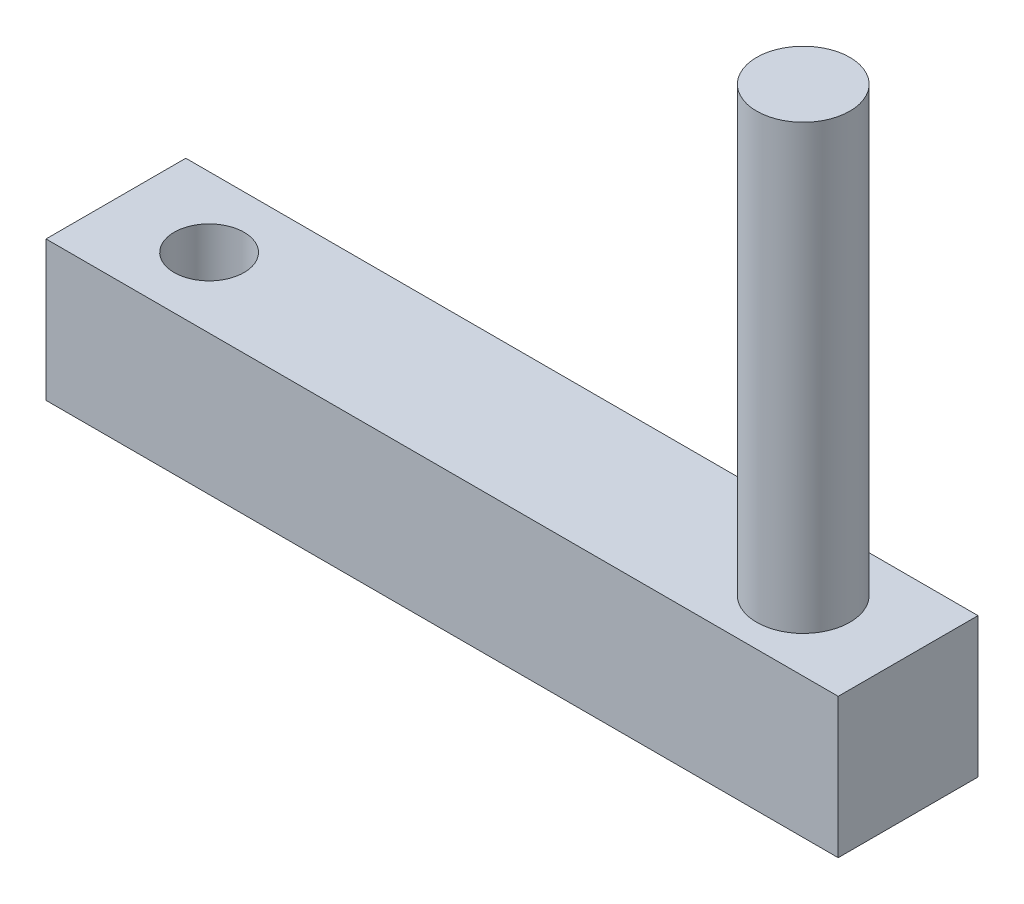
ISO-10303-21;
HEADER;
FILE_DESCRIPTION(('STEP AP214'),'2;1');
FILE_NAME('part.step','',(''),(''),'','','');
FILE_SCHEMA(('AUTOMOTIVE_DESIGN { 1 0 10303 214 1 1 1 1 }'));
ENDSEC;
DATA;
#1=APPLICATION_CONTEXT('core data for automotive mechanical design processes');
#2=APPLICATION_PROTOCOL_DEFINITION('international standard','automotive_design',2000,#1);
#3=PRODUCT_CONTEXT('',#1,'mechanical');
#4=PRODUCT('Part','Part','',(#3));
#5=PRODUCT_RELATED_PRODUCT_CATEGORY('part','',(#4));
#6=PRODUCT_DEFINITION_FORMATION('','',#4);
#7=PRODUCT_DEFINITION_CONTEXT('part definition',#1,'design');
#8=PRODUCT_DEFINITION('design','',#6,#7);
#9=PRODUCT_DEFINITION_SHAPE('','',#8);
#10=(LENGTH_UNIT() NAMED_UNIT(*) SI_UNIT(.MILLI.,.METRE.));
#11=(NAMED_UNIT(*) PLANE_ANGLE_UNIT() SI_UNIT($,.RADIAN.));
#12=(NAMED_UNIT(*) SI_UNIT($,.STERADIAN.) SOLID_ANGLE_UNIT());
#13=UNCERTAINTY_MEASURE_WITH_UNIT(LENGTH_MEASURE(1.E-05),#10,'distance_accuracy_value','');
#14=(GEOMETRIC_REPRESENTATION_CONTEXT(3) GLOBAL_UNCERTAINTY_ASSIGNED_CONTEXT((#13)) GLOBAL_UNIT_ASSIGNED_CONTEXT((#10,
#11,#12)) REPRESENTATION_CONTEXT('',''));
#15=CARTESIAN_POINT('',(0.,0.,0.));
#16=DIRECTION('',(0.,0.,1.));
#17=DIRECTION('',(1.,0.,0.));
#18=AXIS2_PLACEMENT_3D('',#15,#16,#17);
#19=CARTESIAN_POINT('',(0.,3.,0.));
#20=DIRECTION('',(0.,-1.,0.));
#21=DIRECTION('',(0.,0.,-1.));
#22=AXIS2_PLACEMENT_3D('',#19,#20,#21);
#23=PLANE('',#22);
#24=CARTESIAN_POINT('',(6.25,3.,0.));
#25=DIRECTION('',(0.,-1.,0.));
#26=DIRECTION('',(0.,0.,-1.));
#27=AXIS2_PLACEMENT_3D('',#24,#25,#26);
#28=CIRCLE('',#27,0.999999999999999);
#29=CARTESIAN_POINT('',(6.25,3.,-0.999999999999999));
#30=VERTEX_POINT('',#29);
#31=EDGE_CURVE('E11',#30,#30,#28,.F.);
#32=ORIENTED_EDGE('',*,*,#31,.F.);
#33=EDGE_LOOP('',(#32));
#34=FACE_BOUND('',#33,.T.);
#35=DIRECTION('',(0.,0.,-1.));
#36=VECTOR('',#35,1.);
#37=CARTESIAN_POINT('',(8.5,3.,1.5));
#38=LINE('',#37,#36);
#39=CARTESIAN_POINT('',(8.5,3.,1.5));
#40=VERTEX_POINT('',#39);
#41=CARTESIAN_POINT('',(8.5,3.,-1.5));
#42=VERTEX_POINT('',#41);
#43=EDGE_CURVE('E88',#40,#42,#38,.T.);
#44=ORIENTED_EDGE('',*,*,#43,.T.);
#45=DIRECTION('',(-1.,0.,0.));
#46=VECTOR('',#45,1.);
#47=CARTESIAN_POINT('',(-8.5,3.,-1.5));
#48=LINE('',#47,#46);
#49=CARTESIAN_POINT('',(-8.5,3.,-1.5));
#50=VERTEX_POINT('',#49);
#51=EDGE_CURVE('E83',#42,#50,#48,.T.);
#52=ORIENTED_EDGE('',*,*,#51,.T.);
#53=DIRECTION('',(0.,0.,1.));
#54=VECTOR('',#53,1.);
#55=CARTESIAN_POINT('',(-8.5,3.,1.5));
#56=LINE('',#55,#54);
#57=CARTESIAN_POINT('',(-8.5,3.,1.5));
#58=VERTEX_POINT('',#57);
#59=EDGE_CURVE('E86',#50,#58,#56,.T.);
#60=ORIENTED_EDGE('',*,*,#59,.T.);
#61=DIRECTION('',(1.,0.,0.));
#62=VECTOR('',#61,1.);
#63=CARTESIAN_POINT('',(-8.5,3.,1.5));
#64=LINE('',#63,#62);
#65=EDGE_CURVE('E52',#58,#40,#64,.T.);
#66=ORIENTED_EDGE('',*,*,#65,.T.);
#67=EDGE_LOOP('',(#44,#52,#60,#66));
#68=FACE_BOUND('',#67,.T.);
#69=CARTESIAN_POINT('',(-6.5,3.,0.));
#70=DIRECTION('',(0.,1.,0.));
#71=DIRECTION('',(0.,0.,1.));
#72=AXIS2_PLACEMENT_3D('',#69,#70,#71);
#73=CIRCLE('',#72,0.75);
#74=CARTESIAN_POINT('',(-6.5,3.,0.75));
#75=VERTEX_POINT('',#74);
#76=EDGE_CURVE('E105',#75,#75,#73,.T.);
#77=ORIENTED_EDGE('',*,*,#76,.F.);
#78=EDGE_LOOP('',(#77));
#79=FACE_BOUND('',#78,.T.);
#80=ADVANCED_FACE('F35',(#34,#68,#79),#23,.F.);
#81=CARTESIAN_POINT('',(0.,0.,0.));
#82=DIRECTION('',(0.,-1.,0.));
#83=DIRECTION('',(0.,0.,-1.));
#84=AXIS2_PLACEMENT_3D('',#81,#82,#83);
#85=PLANE('',#84);
#86=DIRECTION('',(0.,0.,-1.));
#87=VECTOR('',#86,1.);
#88=CARTESIAN_POINT('',(8.5,0.,1.5));
#89=LINE('',#88,#87);
#90=CARTESIAN_POINT('',(8.5,0.,1.5));
#91=VERTEX_POINT('',#90);
#92=CARTESIAN_POINT('',(8.5,0.,-1.5));
#93=VERTEX_POINT('',#92);
#94=EDGE_CURVE('E102',#91,#93,#89,.T.);
#95=ORIENTED_EDGE('',*,*,#94,.F.);
#96=DIRECTION('',(1.,0.,0.));
#97=VECTOR('',#96,1.);
#98=CARTESIAN_POINT('',(-8.5,0.,1.5));
#99=LINE('',#98,#97);
#100=CARTESIAN_POINT('',(-8.5,0.,1.5));
#101=VERTEX_POINT('',#100);
#102=EDGE_CURVE('E75',#101,#91,#99,.T.);
#103=ORIENTED_EDGE('',*,*,#102,.F.);
#104=DIRECTION('',(0.,0.,1.));
#105=VECTOR('',#104,1.);
#106=CARTESIAN_POINT('',(-8.5,0.,1.5));
#107=LINE('',#106,#105);
#108=CARTESIAN_POINT('',(-8.5,0.,-1.5));
#109=VERTEX_POINT('',#108);
#110=EDGE_CURVE('E69',#109,#101,#107,.T.);
#111=ORIENTED_EDGE('',*,*,#110,.F.);
#112=DIRECTION('',(-1.,0.,0.));
#113=VECTOR('',#112,1.);
#114=CARTESIAN_POINT('',(-8.5,0.,-1.5));
#115=LINE('',#114,#113);
#116=EDGE_CURVE('E93',#93,#109,#115,.T.);
#117=ORIENTED_EDGE('',*,*,#116,.F.);
#118=EDGE_LOOP('',(#95,#103,#111,#117));
#119=FACE_BOUND('',#118,.T.);
#120=CARTESIAN_POINT('',(-6.5,0.,0.));
#121=DIRECTION('',(0.,1.,0.));
#122=DIRECTION('',(0.,0.,1.));
#123=AXIS2_PLACEMENT_3D('',#120,#121,#122);
#124=CIRCLE('',#123,0.75);
#125=CARTESIAN_POINT('',(-6.5,0.,0.75));
#126=VERTEX_POINT('',#125);
#127=EDGE_CURVE('E119',#126,#126,#124,.T.);
#128=ORIENTED_EDGE('',*,*,#127,.T.);
#129=EDGE_LOOP('',(#128));
#130=FACE_BOUND('',#129,.T.);
#131=ADVANCED_FACE('F113',(#119,#130),#85,.T.);
#132=CARTESIAN_POINT('',(8.5,3.,1.5));
#133=DIRECTION('',(-1.,0.,0.));
#134=DIRECTION('',(0.,0.,1.));
#135=AXIS2_PLACEMENT_3D('',#132,#133,#134);
#136=PLANE('',#135);
#137=ORIENTED_EDGE('',*,*,#94,.T.);
#138=DIRECTION('',(0.,-1.,0.));
#139=VECTOR('',#138,1.);
#140=CARTESIAN_POINT('',(8.5,3.,-1.5));
#141=LINE('',#140,#139);
#142=EDGE_CURVE('E44',#42,#93,#141,.T.);
#143=ORIENTED_EDGE('',*,*,#142,.F.);
#144=ORIENTED_EDGE('',*,*,#43,.F.);
#145=DIRECTION('',(0.,-1.,0.));
#146=VECTOR('',#145,1.);
#147=CARTESIAN_POINT('',(8.5,3.,1.5));
#148=LINE('',#147,#146);
#149=EDGE_CURVE('E98',#40,#91,#148,.T.);
#150=ORIENTED_EDGE('',*,*,#149,.T.);
#151=EDGE_LOOP('',(#137,#143,#144,#150));
#152=FACE_BOUND('',#151,.T.);
#153=ADVANCED_FACE('F37',(#152),#136,.F.);
#154=CARTESIAN_POINT('',(-8.5,3.,-1.5));
#155=DIRECTION('',(0.,0.,1.));
#156=DIRECTION('',(1.,0.,0.));
#157=AXIS2_PLACEMENT_3D('',#154,#155,#156);
#158=PLANE('',#157);
#159=ORIENTED_EDGE('',*,*,#116,.T.);
#160=DIRECTION('',(0.,-1.,0.));
#161=VECTOR('',#160,1.);
#162=CARTESIAN_POINT('',(-8.5,3.,-1.5));
#163=LINE('',#162,#161);
#164=EDGE_CURVE('E91',#50,#109,#163,.T.);
#165=ORIENTED_EDGE('',*,*,#164,.F.);
#166=ORIENTED_EDGE('',*,*,#51,.F.);
#167=ORIENTED_EDGE('',*,*,#142,.T.);
#168=EDGE_LOOP('',(#159,#165,#166,#167));
#169=FACE_BOUND('',#168,.T.);
#170=ADVANCED_FACE('F92',(#169),#158,.F.);
#171=CARTESIAN_POINT('',(-8.5,3.,1.5));
#172=DIRECTION('',(1.,0.,0.));
#173=DIRECTION('',(0.,0.,-1.));
#174=AXIS2_PLACEMENT_3D('',#171,#172,#173);
#175=PLANE('',#174);
#176=ORIENTED_EDGE('',*,*,#110,.T.);
#177=DIRECTION('',(0.,-1.,0.));
#178=VECTOR('',#177,1.);
#179=CARTESIAN_POINT('',(-8.5,3.,1.5));
#180=LINE('',#179,#178);
#181=EDGE_CURVE('E94',#58,#101,#180,.T.);
#182=ORIENTED_EDGE('',*,*,#181,.F.);
#183=ORIENTED_EDGE('',*,*,#59,.F.);
#184=ORIENTED_EDGE('',*,*,#164,.T.);
#185=EDGE_LOOP('',(#176,#182,#183,#184));
#186=FACE_BOUND('',#185,.T.);
#187=ADVANCED_FACE('F96',(#186),#175,.F.);
#188=CARTESIAN_POINT('',(-8.5,3.,1.5));
#189=DIRECTION('',(0.,0.,-1.));
#190=DIRECTION('',(-1.,0.,0.));
#191=AXIS2_PLACEMENT_3D('',#188,#189,#190);
#192=PLANE('',#191);
#193=ORIENTED_EDGE('',*,*,#102,.T.);
#194=ORIENTED_EDGE('',*,*,#149,.F.);
#195=ORIENTED_EDGE('',*,*,#65,.F.);
#196=ORIENTED_EDGE('',*,*,#181,.T.);
#197=EDGE_LOOP('',(#193,#194,#195,#196));
#198=FACE_BOUND('',#197,.T.);
#199=ADVANCED_FACE('F144',(#198),#192,.F.);
#200=CARTESIAN_POINT('',(-6.5,3.,0.));
#201=DIRECTION('',(0.,-1.,0.));
#202=DIRECTION('',(0.,0.,-1.));
#203=AXIS2_PLACEMENT_3D('',#200,#201,#202);
#204=CYLINDRICAL_SURFACE('',#203,0.75);
#205=ORIENTED_EDGE('',*,*,#76,.T.);
#206=EDGE_LOOP('',(#205));
#207=FACE_BOUND('',#206,.T.);
#208=ORIENTED_EDGE('',*,*,#127,.F.);
#209=EDGE_LOOP('',(#208));
#210=FACE_BOUND('',#209,.T.);
#211=ADVANCED_FACE('F134',(#207,#210),#204,.F.);
#212=CARTESIAN_POINT('',(6.25,12.5,0.));
#213=DIRECTION('',(0.,-1.,0.));
#214=DIRECTION('',(0.,0.,-1.));
#215=AXIS2_PLACEMENT_3D('',#212,#213,#214);
#216=CYLINDRICAL_SURFACE('',#215,0.999999999999999);
#217=CARTESIAN_POINT('',(6.25,12.5,0.));
#218=DIRECTION('',(0.,1.,0.));
#219=DIRECTION('',(0.,0.,1.));
#220=AXIS2_PLACEMENT_3D('',#217,#218,#219);
#221=CIRCLE('',#220,0.999999999999999);
#222=CARTESIAN_POINT('',(6.25,12.5,0.999999999999999));
#223=VERTEX_POINT('',#222);
#224=EDGE_CURVE('E121',#223,#223,#221,.T.);
#225=ORIENTED_EDGE('',*,*,#224,.F.);
#226=EDGE_LOOP('',(#225));
#227=FACE_BOUND('',#226,.T.);
#228=ORIENTED_EDGE('',*,*,#31,.T.);
#229=EDGE_LOOP('',(#228));
#230=FACE_BOUND('',#229,.T.);
#231=ADVANCED_FACE('F131',(#227,#230),#216,.T.);
#232=CARTESIAN_POINT('',(6.25,12.5,0.));
#233=DIRECTION('',(0.,1.,0.));
#234=DIRECTION('',(0.,0.,1.));
#235=AXIS2_PLACEMENT_3D('',#232,#233,#234);
#236=PLANE('',#235);
#237=ORIENTED_EDGE('',*,*,#224,.T.);
#238=EDGE_LOOP('',(#237));
#239=FACE_BOUND('',#238,.T.);
#240=ADVANCED_FACE('F129',(#239),#236,.T.);
#241=CLOSED_SHELL('',(#80,#131,#153,#170,#187,#199,#211,#231,#240));
#242=MANIFOLD_SOLID_BREP('B2',#241);
#243=ADVANCED_BREP_SHAPE_REPRESENTATION('',(#18,#242),#14);
#244=SHAPE_DEFINITION_REPRESENTATION(#9,#243);
ENDSEC;
END-ISO-10303-21;
